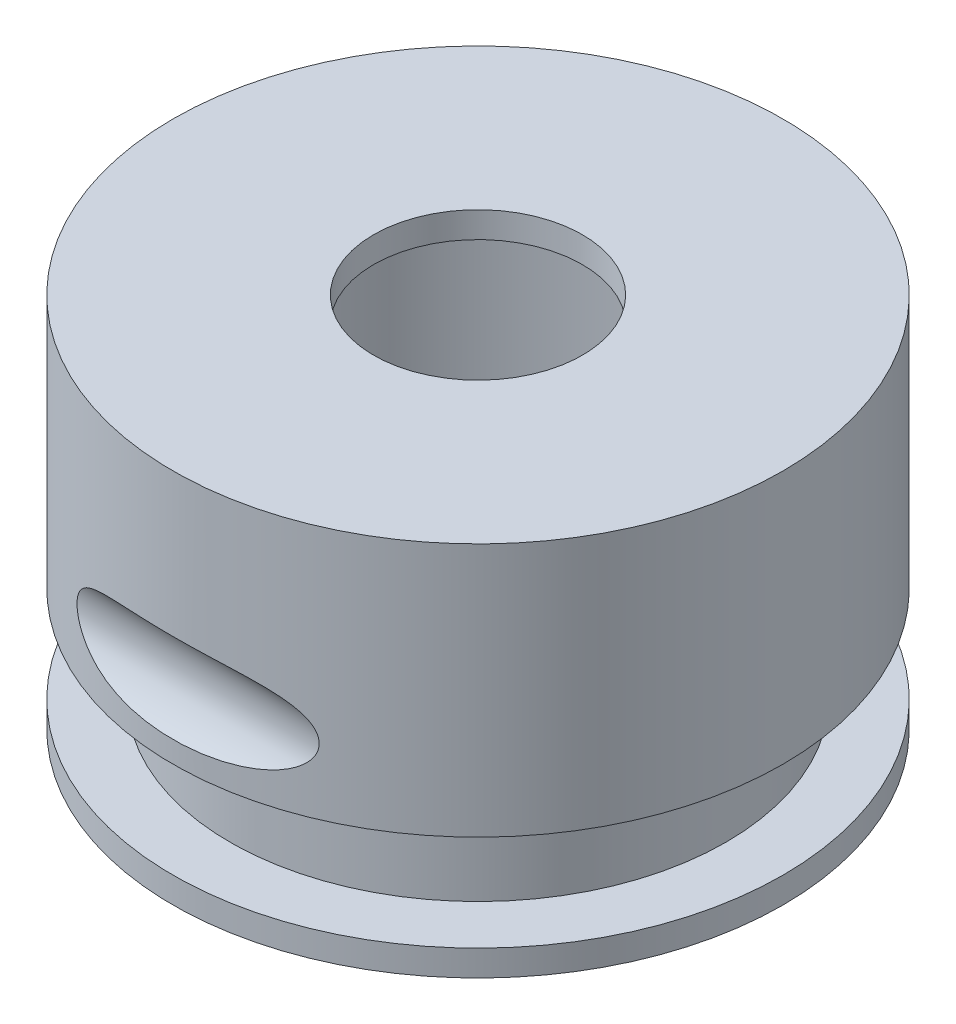
ISO-10303-21;
HEADER;
FILE_DESCRIPTION(('STEP AP214'),'2;1');
FILE_NAME('part.step','',(''),(''),'','','');
FILE_SCHEMA(('AUTOMOTIVE_DESIGN { 1 0 10303 214 1 1 1 1 }'));
ENDSEC;
DATA;
#1=APPLICATION_CONTEXT('core data for automotive mechanical design processes');
#2=APPLICATION_PROTOCOL_DEFINITION('international standard','automotive_design',2000,#1);
#3=PRODUCT_CONTEXT('',#1,'mechanical');
#4=PRODUCT('Part','Part','',(#3));
#5=PRODUCT_RELATED_PRODUCT_CATEGORY('part','',(#4));
#6=PRODUCT_DEFINITION_FORMATION('','',#4);
#7=PRODUCT_DEFINITION_CONTEXT('part definition',#1,'design');
#8=PRODUCT_DEFINITION('design','',#6,#7);
#9=PRODUCT_DEFINITION_SHAPE('','',#8);
#10=(LENGTH_UNIT() NAMED_UNIT(*) SI_UNIT(.MILLI.,.METRE.));
#11=(NAMED_UNIT(*) PLANE_ANGLE_UNIT() SI_UNIT($,.RADIAN.));
#12=(NAMED_UNIT(*) SI_UNIT($,.STERADIAN.) SOLID_ANGLE_UNIT());
#13=UNCERTAINTY_MEASURE_WITH_UNIT(LENGTH_MEASURE(1.E-05),#10,'distance_accuracy_value','');
#14=(GEOMETRIC_REPRESENTATION_CONTEXT(3) GLOBAL_UNCERTAINTY_ASSIGNED_CONTEXT((#13)) GLOBAL_UNIT_ASSIGNED_CONTEXT((#10,
#11,#12)) REPRESENTATION_CONTEXT('',''));
#15=CARTESIAN_POINT('',(0.,0.,0.));
#16=DIRECTION('',(0.,0.,1.));
#17=DIRECTION('',(1.,0.,0.));
#18=AXIS2_PLACEMENT_3D('',#15,#16,#17);
#19=CARTESIAN_POINT('',(0.,0.,0.));
#20=DIRECTION('',(0.,-1.,0.));
#21=DIRECTION('',(1.,0.,0.));
#22=AXIS2_PLACEMENT_3D('',#19,#20,#21);
#23=CYLINDRICAL_SURFACE('',#22,18.542);
#24=CARTESIAN_POINT('',(0.,0.,0.));
#25=DIRECTION('',(0.,-1.,0.));
#26=DIRECTION('',(1.,0.,0.));
#27=AXIS2_PLACEMENT_3D('',#24,#25,#26);
#28=CIRCLE('',#27,18.542);
#29=CARTESIAN_POINT('',(18.542,0.,0.));
#30=VERTEX_POINT('',#29);
#31=EDGE_CURVE('E90',#30,#30,#28,.F.);
#32=ORIENTED_EDGE('',*,*,#31,.T.);
#33=EDGE_LOOP('',(#32));
#34=FACE_BOUND('',#33,.T.);
#35=CARTESIAN_POINT('',(0.,1.57479999999999,0.));
#36=DIRECTION('',(0.,-1.,0.));
#37=DIRECTION('',(1.,0.,0.));
#38=AXIS2_PLACEMENT_3D('',#35,#36,#37);
#39=CIRCLE('',#38,18.542);
#40=CARTESIAN_POINT('',(18.542,1.57479999999999,0.));
#41=VERTEX_POINT('',#40);
#42=EDGE_CURVE('E17',#41,#41,#39,.T.);
#43=ORIENTED_EDGE('',*,*,#42,.T.);
#44=EDGE_LOOP('',(#43));
#45=FACE_BOUND('',#44,.T.);
#46=ADVANCED_FACE('F14',(#34,#45),#23,.T.);
#47=CARTESIAN_POINT('',(-18.542,1.57480000000182,0.));
#48=DIRECTION('',(0.,-1.,0.));
#49=DIRECTION('',(1.,0.,0.));
#50=AXIS2_PLACEMENT_3D('',#47,#48,#49);
#51=PLANE('',#50);
#52=CARTESIAN_POINT('',(0.,1.57479999999999,0.));
#53=DIRECTION('',(0.,-1.,0.));
#54=DIRECTION('',(1.,0.,0.));
#55=AXIS2_PLACEMENT_3D('',#52,#53,#54);
#56=CIRCLE('',#55,15.0749);
#57=CARTESIAN_POINT('',(15.0749,1.57479999999999,0.));
#58=VERTEX_POINT('',#57);
#59=EDGE_CURVE('E88',#58,#58,#56,.F.);
#60=ORIENTED_EDGE('',*,*,#59,.F.);
#61=EDGE_LOOP('',(#60));
#62=FACE_BOUND('',#61,.T.);
#63=ORIENTED_EDGE('',*,*,#42,.F.);
#64=EDGE_LOOP('',(#63));
#65=FACE_BOUND('',#64,.T.);
#66=ADVANCED_FACE('F98',(#62,#65),#51,.F.);
#67=CARTESIAN_POINT('',(0.,0.,0.));
#68=DIRECTION('',(0.,1.,0.));
#69=DIRECTION('',(-1.,0.,0.));
#70=AXIS2_PLACEMENT_3D('',#67,#68,#69);
#71=PLANE('',#70);
#72=ORIENTED_EDGE('',*,*,#31,.F.);
#73=EDGE_LOOP('',(#72));
#74=FACE_BOUND('',#73,.T.);
#75=CARTESIAN_POINT('',(0.,0.,0.));
#76=DIRECTION('',(0.,-1.,0.));
#77=DIRECTION('',(1.,0.,0.));
#78=AXIS2_PLACEMENT_3D('',#75,#76,#77);
#79=CIRCLE('',#78,14.2875);
#80=CARTESIAN_POINT('',(14.2875,0.,0.));
#81=VERTEX_POINT('',#80);
#82=EDGE_CURVE('E85',#81,#81,#79,.F.);
#83=ORIENTED_EDGE('',*,*,#82,.T.);
#84=EDGE_LOOP('',(#83));
#85=FACE_BOUND('',#84,.T.);
#86=ADVANCED_FACE('F100',(#74,#85),#71,.F.);
#87=CARTESIAN_POINT('',(0.,0.,0.));
#88=DIRECTION('',(0.,-1.,0.));
#89=DIRECTION('',(1.,0.,0.));
#90=AXIS2_PLACEMENT_3D('',#87,#88,#89);
#91=CYLINDRICAL_SURFACE('',#90,15.0749);
#92=ORIENTED_EDGE('',*,*,#59,.T.);
#93=EDGE_LOOP('',(#92));
#94=FACE_BOUND('',#93,.T.);
#95=CARTESIAN_POINT('',(0.,7.4168,0.));
#96=DIRECTION('',(0.,-1.,0.));
#97=DIRECTION('',(1.,0.,0.));
#98=AXIS2_PLACEMENT_3D('',#95,#96,#97);
#99=CIRCLE('',#98,15.0749);
#100=CARTESIAN_POINT('',(15.0749,7.4168,0.));
#101=VERTEX_POINT('',#100);
#102=EDGE_CURVE('E79',#101,#101,#99,.T.);
#103=ORIENTED_EDGE('',*,*,#102,.T.);
#104=EDGE_LOOP('',(#103));
#105=FACE_BOUND('',#104,.T.);
#106=ADVANCED_FACE('F71',(#94,#105),#91,.T.);
#107=CARTESIAN_POINT('',(0.,21.2852,0.));
#108=DIRECTION('',(0.,-1.,0.));
#109=DIRECTION('',(1.,0.,0.));
#110=AXIS2_PLACEMENT_3D('',#107,#108,#109);
#111=CYLINDRICAL_SURFACE('',#110,14.2875);
#112=CARTESIAN_POINT('',(-2.413,16.51,-14.0822614394848));
#113=CARTESIAN_POINT('',(-2.4129941654229,16.6444828539525,-14.0822640849239));
#114=CARTESIAN_POINT('',(-2.40171811928791,16.7790494973515,-14.0842089812061));
#115=CARTESIAN_POINT('',(-2.35692840265132,17.0444175766794,-14.0917720706717));
#116=CARTESIAN_POINT('',(-2.32339144732905,17.1752149203015,-14.0973941100415));
#117=CARTESIAN_POINT('',(-2.23512439102644,17.4291491082443,-14.1116568909036));
#118=CARTESIAN_POINT('',(-2.18041297379245,17.5522925952444,-14.1202949704718));
#119=CARTESIAN_POINT('',(-2.05139845079649,17.7876315555916,-14.1396129748515));
#120=CARTESIAN_POINT('',(-1.97709865871781,17.8998288762618,-14.1502925542272));
#121=CARTESIAN_POINT('',(-1.81022070536362,18.1112394069196,-14.1726104972307));
#122=CARTESIAN_POINT('',(-1.71748441936084,18.2103269927262,-14.1842566084736));
#123=CARTESIAN_POINT('',(-1.51668034327324,18.3916353589007,-14.2071294668387));
#124=CARTESIAN_POINT('',(-1.40860831500469,18.4738514612519,-14.2183560969461));
#125=CARTESIAN_POINT('',(-1.17936073480606,18.6195614877155,-14.239209533785));
#126=CARTESIAN_POINT('',(-1.05810387132596,18.6829290509236,-14.2488253620799));
#127=CARTESIAN_POINT('',(-0.806560128270515,18.7882847430487,-14.2652703332391));
#128=CARTESIAN_POINT('',(-0.676283587127068,18.8302969034328,-14.2721026067408));
#129=CARTESIAN_POINT('',(-0.454426863714997,18.88158745711,-14.2805506002235));
#130=CARTESIAN_POINT('',(-0.364274332939682,18.897093960641,-14.2831439024362));
#131=CARTESIAN_POINT('',(-0.182760749327515,18.9178021402957,-14.2866194430846));
#132=CARTESIAN_POINT('',(-0.0913997128679932,18.9230039559219,-14.2875017046841));
#133=CARTESIAN_POINT('',(0.134498264747015,18.9229941787058,-14.2874974914905));
#134=CARTESIAN_POINT('',(0.269080280463436,18.911715635197,-14.2855808178532));
#135=CARTESIAN_POINT('',(0.534480313001756,18.8669150955965,-14.2781184431882));
#136=CARTESIAN_POINT('',(0.665294249469493,18.8333698673672,-14.2725689519125));
#137=CARTESIAN_POINT('',(0.919263544158507,18.7450786210434,-14.2584633042745));
#138=CARTESIAN_POINT('',(1.04242540527749,18.6903508983901,-14.2499097431335));
#139=CARTESIAN_POINT('',(1.27779527143734,18.5612979540388,-14.2307363346093));
#140=CARTESIAN_POINT('',(1.39000514595465,18.4869760850566,-14.2201168408054));
#141=CARTESIAN_POINT('',(1.60140200107601,18.3200756223334,-14.1978723461087));
#142=CARTESIAN_POINT('',(1.70046721739635,18.2273438522937,-14.1862394026316));
#143=CARTESIAN_POINT('',(1.88173226159046,18.0265582632878,-14.1633368183182));
#144=CARTESIAN_POINT('',(1.96392734302548,17.9185001466513,-14.1520672804763));
#145=CARTESIAN_POINT('',(2.1096150168268,17.6892652113623,-14.1310880972426));
#146=CARTESIAN_POINT('',(2.17297748654591,17.5680046849356,-14.1213895063312));
#147=CARTESIAN_POINT('',(2.27832271517408,17.3164530339822,-14.1047783428417));
#148=CARTESIAN_POINT('',(2.3203295808649,17.1861722814071,-14.0978626307225));
#149=CARTESIAN_POINT('',(2.37160527301209,16.9643296254771,-14.089306452022));
#150=CARTESIAN_POINT('',(2.38710506140066,16.8741966035536,-14.0866779981716));
#151=CARTESIAN_POINT('',(2.40780433382248,16.6927219384709,-14.0831546054678));
#152=CARTESIAN_POINT('',(2.41300396456101,16.6013803125445,-14.0822596419244));
#153=CARTESIAN_POINT('',(2.4129941654229,16.3755171460475,-14.0822640849239));
#154=CARTESIAN_POINT('',(2.40171811928791,16.2409505026485,-14.0842089812061));
#155=CARTESIAN_POINT('',(2.35692840265132,15.9755824233206,-14.0917720706717));
#156=CARTESIAN_POINT('',(2.32339144732905,15.8447850796986,-14.0973941100415));
#157=CARTESIAN_POINT('',(2.23512439102644,15.5908508917558,-14.1116568909036));
#158=CARTESIAN_POINT('',(2.18041297379245,15.4677074047557,-14.1202949704718));
#159=CARTESIAN_POINT('',(2.05139845079648,15.2323684444084,-14.1396129748515));
#160=CARTESIAN_POINT('',(1.97709865871781,15.1201711237383,-14.1502925542272));
#161=CARTESIAN_POINT('',(1.81022070536362,14.9087605930805,-14.1726104972307));
#162=CARTESIAN_POINT('',(1.71748441936083,14.8096730072739,-14.1842566084736));
#163=CARTESIAN_POINT('',(1.51668034327324,14.6283646410994,-14.2071294668387));
#164=CARTESIAN_POINT('',(1.40860831500468,14.5461485387482,-14.2183560969461));
#165=CARTESIAN_POINT('',(1.17936073480606,14.4004385122846,-14.239209533785));
#166=CARTESIAN_POINT('',(1.05810387132596,14.3370709490764,-14.2488253620799));
#167=CARTESIAN_POINT('',(0.806560128270514,14.2317152569513,-14.2652703332391));
#168=CARTESIAN_POINT('',(0.676283587127068,14.1897030965673,-14.2721026067408));
#169=CARTESIAN_POINT('',(0.454426863715122,14.1384125428901,-14.2805506002235));
#170=CARTESIAN_POINT('',(0.364274332939936,14.1229060393591,-14.2831439024362));
#171=CARTESIAN_POINT('',(0.182760749328028,14.1021978597044,-14.2866194430846));
#172=CARTESIAN_POINT('',(0.0913997128686367,14.0969960440782,-14.287501704684));
#173=CARTESIAN_POINT('',(-0.134498264746241,14.0970058212942,-14.2874974914905));
#174=CARTESIAN_POINT('',(-0.269080280462665,14.108284364803,-14.2855808178532));
#175=CARTESIAN_POINT('',(-0.534480313000997,14.1530849044034,-14.2781184431882));
#176=CARTESIAN_POINT('',(-0.665294249468743,14.1866301326327,-14.2725689519125));
#177=CARTESIAN_POINT('',(-0.919263544157785,14.2749213789564,-14.2584633042746));
#178=CARTESIAN_POINT('',(-1.04242540527678,14.3296491016097,-14.2499097431335));
#179=CARTESIAN_POINT('',(-1.27779527143667,14.4587020459609,-14.2307363346094));
#180=CARTESIAN_POINT('',(-1.39000514595401,14.533023914943,-14.2201168408054));
#181=CARTESIAN_POINT('',(-1.60140200107542,14.6999243776662,-14.1978723461088));
#182=CARTESIAN_POINT('',(-1.70046721739579,14.7926561477058,-14.1862394026317));
#183=CARTESIAN_POINT('',(-1.88173226158996,14.9934417367116,-14.1633368183183));
#184=CARTESIAN_POINT('',(-1.96392734302502,15.1014998533481,-14.1520672804764));
#185=CARTESIAN_POINT('',(-2.10961501682641,15.3307347886371,-14.1310880972427));
#186=CARTESIAN_POINT('',(-2.17297748654556,15.4519953150637,-14.1213895063312));
#187=CARTESIAN_POINT('',(-2.27832271517381,15.7035469660171,-14.1047783428417));
#188=CARTESIAN_POINT('',(-2.32032958086468,15.8338277185922,-14.0978626307225));
#189=CARTESIAN_POINT('',(-2.37160527301197,16.0556703745224,-14.0893064520221));
#190=CARTESIAN_POINT('',(-2.38710506140059,16.1458033964459,-14.0866779981716));
#191=CARTESIAN_POINT('',(-2.40780433382246,16.3272780615289,-14.0831546054678));
#192=CARTESIAN_POINT('',(-2.41300396456101,16.4186196874554,-14.0822596419244));
#193=CARTESIAN_POINT('',(-2.413,16.51,-14.0822614394848));
#194=B_SPLINE_CURVE_WITH_KNOTS('',3,(#112,#113,#114,#115,#116,#117,#118,#119,#120,#121,#122,
#123,#124,#125,#126,#127,#128,#129,#130,#131,#132,#133,#134,#135,#136,#137,#138,#139,#140,#141,
#142,#143,#144,#145,#146,#147,#148,#149,#150,#151,#152,#153,#154,#155,#156,#157,#158,#159,#160,
#161,#162,#163,#164,#165,#166,#167,#168,#169,#170,#171,#172,#173,#174,#175,#176,#177,#178,#179,
#180,#181,#182,#183,#184,#185,#186,#187,#188,#189,#190,#191,#192,#193),.UNSPECIFIED.,.T.,.F.,(4,
2,2,2,2,2,2,2,2,2,2,2,2,2,2,2,2,2,2,2,2,2,2,2,2,2,2,2,2,2,2,2,2,2,2,2,2,2,2,2,4),(0.,
0.403113083801031,0.806648488112731,1.20982863302685,1.61294061735989,2.01967198910566,
2.42651598478672,2.8360289872107,3.2450801343052,3.51905505675224,3.79302627016403,
4.19618566353341,4.59976635930512,5.00299925518491,5.40616319940577,5.81283391453748,
6.21961889073664,6.62915245437704,7.03822269324399,7.31213957693063,7.58605255918719,
7.98916564298822,8.39270104729992,8.79588119221403,9.19899317654708,9.60572454829285,
10.0125685439739,10.4220815463979,10.8311326934924,11.105107615939,11.3790788293504,
11.7822382227198,12.1858189184915,12.5890518143713,12.9922157585922,13.3988864737239,
13.805671449923,14.2152050135634,14.6242752524304,14.8981921361174,15.1721051183744),.UNSPECIFIED.);
#195=CARTESIAN_POINT('',(-2.413,16.51,-14.0822614394848));
#196=VERTEX_POINT('',#195);
#197=EDGE_CURVE('E74',#196,#196,#194,.T.);
#198=ORIENTED_EDGE('',*,*,#197,.T.);
#199=EDGE_LOOP('',(#198));
#200=FACE_BOUND('',#199,.T.);
#201=CARTESIAN_POINT('',(0.,21.2852,0.));
#202=DIRECTION('',(0.,-1.,0.));
#203=DIRECTION('',(1.,0.,0.));
#204=AXIS2_PLACEMENT_3D('',#201,#202,#203);
#205=CIRCLE('',#204,14.2875);
#206=CARTESIAN_POINT('',(14.2875,21.2852,0.));
#207=VERTEX_POINT('',#206);
#208=EDGE_CURVE('E82',#207,#207,#205,.T.);
#209=ORIENTED_EDGE('',*,*,#208,.F.);
#210=EDGE_LOOP('',(#209));
#211=FACE_BOUND('',#210,.T.);
#212=ORIENTED_EDGE('',*,*,#82,.F.);
#213=EDGE_LOOP('',(#212));
#214=FACE_BOUND('',#213,.T.);
#215=ADVANCED_FACE('F66',(#200,#211,#214),#111,.F.);
#216=CARTESIAN_POINT('',(0.,21.2852,0.));
#217=DIRECTION('',(0.,-1.,0.));
#218=DIRECTION('',(1.,0.,0.));
#219=AXIS2_PLACEMENT_3D('',#216,#217,#218);
#220=PLANE('',#219);
#221=ORIENTED_EDGE('',*,*,#208,.T.);
#222=EDGE_LOOP('',(#221));
#223=FACE_BOUND('',#222,.T.);
#224=CARTESIAN_POINT('',(0.,21.2852,0.));
#225=DIRECTION('',(0.,1.,0.));
#226=DIRECTION('',(-1.,0.,0.));
#227=AXIS2_PLACEMENT_3D('',#224,#225,#226);
#228=CIRCLE('',#227,6.35);
#229=CARTESIAN_POINT('',(-6.35,21.2852,0.));
#230=VERTEX_POINT('',#229);
#231=EDGE_CURVE('E55',#230,#230,#228,.T.);
#232=ORIENTED_EDGE('',*,*,#231,.T.);
#233=EDGE_LOOP('',(#232));
#234=FACE_BOUND('',#233,.T.);
#235=ADVANCED_FACE('F62',(#223,#234),#220,.T.);
#236=CARTESIAN_POINT('',(-18.5419999999994,11.4300000000019,20.193));
#237=DIRECTION('',(1.,0.,0.));
#238=DIRECTION('',(0.,1.,0.));
#239=AXIS2_PLACEMENT_3D('',#236,#237,#238);
#240=CYLINDRICAL_SURFACE('',#239,3.175);
#241=CARTESIAN_POINT('',(0.,14.1419778760178,18.542));
#242=CARTESIAN_POINT('',(0.209689416286932,14.1419776634456,18.5420000356464));
#243=CARTESIAN_POINT('',(0.419377848483888,14.1398214428807,18.5384421615188));
#244=CARTESIAN_POINT('',(0.838420806961999,14.1310871751409,18.5242209719151));
#245=CARTESIAN_POINT('',(1.04777533736145,14.1245091829328,18.5135577447653));
#246=CARTESIAN_POINT('',(1.46606376682757,14.1065881506321,18.4851404623851));
#247=CARTESIAN_POINT('',(1.67499681669532,14.0952391831695,18.4673775880428));
#248=CARTESIAN_POINT('',(2.09178491636182,14.0671999408883,18.4248222836886));
#249=CARTESIAN_POINT('',(2.29964000202272,14.0505098449341,18.4000300890785));
#250=CARTESIAN_POINT('',(2.71256539435544,14.0110558846209,18.3436884856784));
#251=CARTESIAN_POINT('',(2.91764494530773,13.9883294807597,18.3121809816552));
#252=CARTESIAN_POINT('',(3.32577788574017,13.9355907055532,18.2424729949647));
#253=CARTESIAN_POINT('',(3.52883088747169,13.9055769666956,18.204271256459));
#254=CARTESIAN_POINT('',(3.93169225419007,13.8367652316009,18.1215274359547));
#255=CARTESIAN_POINT('',(4.13150660724591,13.7979860753498,18.0769990273517));
#256=CARTESIAN_POINT('',(4.52721775088981,13.7095228386223,17.9819741771628));
#257=CARTESIAN_POINT('',(4.72311673896977,13.6598450738374,17.9314811998057));
#258=CARTESIAN_POINT('',(4.99823096505494,13.5792642890026,17.8558308454542));
#259=CARTESIAN_POINT('',(5.07970592249081,13.5540132159264,17.8328191257023));
#260=CARTESIAN_POINT('',(5.24148712528007,13.5007356747083,17.7859403989104));
#261=CARTESIAN_POINT('',(5.32179338641675,13.4727092440876,17.7620734034361));
#262=CARTESIAN_POINT('',(5.56121824815225,13.3838041282604,17.6891613943912));
#263=CARTESIAN_POINT('',(5.7183248284638,13.3182467730076,17.6389482894549));
#264=CARTESIAN_POINT('',(5.96617882636381,13.1994640599236,17.5562098011486));
#265=CARTESIAN_POINT('',(6.05941821430119,13.1510460881857,17.5242286425966));
#266=CARTESIAN_POINT('',(6.24195655575993,13.0471909475673,17.4600426053391));
#267=CARTESIAN_POINT('',(6.33125315823655,12.9917496649895,17.4278376060591));
#268=CARTESIAN_POINT('',(6.50404547452521,12.8730538729412,17.3640891191981));
#269=CARTESIAN_POINT('',(6.58756945577175,12.8098423846904,17.3325430281958));
#270=CARTESIAN_POINT('',(6.74728696966417,12.6742008383872,17.2709923433093));
#271=CARTESIAN_POINT('',(6.82349265639715,12.6017865458526,17.2409852335425));
#272=CARTESIAN_POINT('',(6.95336070195983,12.4600752480956,17.1889659972502));
#273=CARTESIAN_POINT('',(7.00863465859888,12.3924487096999,17.1664735252406));
#274=CARTESIAN_POINT('',(7.11007916788057,12.2495895339851,17.1247057473368));
#275=CARTESIAN_POINT('',(7.15624549822551,12.1743533931876,17.1054319342463));
#276=CARTESIAN_POINT('',(7.23707115715186,12.0155599617991,17.0713948971341));
#277=CARTESIAN_POINT('',(7.27157131359909,11.9319063220052,17.0566942696952));
#278=CARTESIAN_POINT('',(7.32481139203501,11.7589826844392,17.0339007328419));
#279=CARTESIAN_POINT('',(7.343613874358,11.6697365195426,17.0257815978392));
#280=CARTESIAN_POINT('',(7.35618306166899,11.5546948287133,17.0203506653073));
#281=CARTESIAN_POINT('',(7.35821745598825,11.5298133586953,17.0194712527155));
#282=CARTESIAN_POINT('',(7.3609369541734,11.4799586176424,17.0182952642664));
#283=CARTESIAN_POINT('',(7.36162185053015,11.4549853330808,17.0179987780444));
#284=CARTESIAN_POINT('',(7.36161185658816,11.3536232765271,17.01800373535));
#285=CARTESIAN_POINT('',(7.35518135596733,11.2771339667984,17.0207893771684));
#286=CARTESIAN_POINT('',(7.33004282179063,11.1265183934957,17.031629726184));
#287=CARTESIAN_POINT('',(7.3113063781572,11.0523980151893,17.0396966258021));
#288=CARTESIAN_POINT('',(7.2633188282434,10.9090033460349,17.0602059593835));
#289=CARTESIAN_POINT('',(7.23415066206763,10.8396958383508,17.0726138626041));
#290=CARTESIAN_POINT('',(7.16717259850072,10.7062380790036,17.1008399336));
#291=CARTESIAN_POINT('',(7.12936240268834,10.6420880055374,17.1166582191395));
#292=CARTESIAN_POINT('',(7.01811745222925,10.4763242200239,17.1626763943894));
#293=CARTESIAN_POINT('',(6.9382066624289,10.3797196514009,17.1952219953315));
#294=CARTESIAN_POINT('',(6.76513482807936,10.200717653182,17.2640508978979));
#295=CARTESIAN_POINT('',(6.67193155012426,10.118367433646,17.3003460072016));
#296=CARTESIAN_POINT('',(6.48696239801546,9.97406040070867,17.3704872995751));
#297=CARTESIAN_POINT('',(6.39608717628443,9.91086785370162,17.404186463198));
#298=CARTESIAN_POINT('',(6.209067219563,9.79286115887927,17.4717814614594));
#299=CARTESIAN_POINT('',(6.11291814345099,9.73805405844477,17.5056774369439));
#300=CARTESIAN_POINT('',(5.91652105577033,9.63552434639299,17.573029047651));
#301=CARTESIAN_POINT('',(5.81626473445576,9.58781710360901,17.6064835887512));
#302=CARTESIAN_POINT('',(5.61277506075185,9.49859956302676,17.6724067758523));
#303=CARTESIAN_POINT('',(5.50954246959037,9.45708769714897,17.7048756696623));
#304=CARTESIAN_POINT('',(5.29481388256823,9.37719054998461,17.770312527805));
#305=CARTESIAN_POINT('',(5.18318057388106,9.33911449510883,17.8032050172246));
#306=CARTESIAN_POINT('',(4.95780634946536,9.26807345140026,17.8672791430537));
#307=CARTESIAN_POINT('',(4.84406497163786,9.23510959838294,17.8984603982743));
#308=CARTESIAN_POINT('',(4.50013457004837,9.14279088113997,17.9891835981109));
#309=CARTESIAN_POINT('',(4.26739476605625,9.09006420914779,18.04585736963));
#310=CARTESIAN_POINT('',(3.79735357546868,8.99812702300183,18.1505912169153));
#311=CARTESIAN_POINT('',(3.56005020609983,8.95892253073223,18.1986474504383));
#312=CARTESIAN_POINT('',(3.0823903191895,8.89119674290003,18.2856099749894));
#313=CARTESIAN_POINT('',(2.84203514279481,8.86267091178322,18.3245201480102));
#314=CARTESIAN_POINT('',(2.3862456978883,8.81697687305575,18.3890860294092));
#315=CARTESIAN_POINT('',(2.17104098117797,8.79889346689032,18.4157390368195));
#316=CARTESIAN_POINT('',(1.73941972138531,8.76855015333383,18.4615080553054));
#317=CARTESIAN_POINT('',(1.52300314158693,8.75629042336028,18.4806238367576));
#318=CARTESIAN_POINT('',(1.08902006252735,8.73690792358868,18.5112724507458));
#319=CARTESIAN_POINT('',(0.871452199679973,8.72979436963531,18.5227916760172));
#320=CARTESIAN_POINT('',(0.435922560162136,8.72035113493047,18.5381557921424));
#321=CARTESIAN_POINT('',(0.217960748452466,8.71802190302787,18.5419999629475));
#322=CARTESIAN_POINT('',(-0.209689416286836,8.71802233655734,18.5420000356464));
#323=CARTESIAN_POINT('',(-0.419377848483779,8.72017855712281,18.5384421615188));
#324=CARTESIAN_POINT('',(-0.838420806961878,8.72891282486305,18.5242209719151));
#325=CARTESIAN_POINT('',(-1.04777533736133,8.73549081707095,18.5135577447653));
#326=CARTESIAN_POINT('',(-1.46606376682746,8.75341184937156,18.4851404623851));
#327=CARTESIAN_POINT('',(-1.67499681669521,8.76476081683423,18.4673775880428));
#328=CARTESIAN_POINT('',(-2.09178491636172,8.79280005911539,18.4248222836886));
#329=CARTESIAN_POINT('',(-2.29964000202262,8.80949015506956,18.4000300890785));
#330=CARTESIAN_POINT('',(-2.71256539435535,8.84894411538281,18.3436884856784));
#331=CARTESIAN_POINT('',(-2.91764494530764,8.87167051924398,18.3121809816552));
#332=CARTESIAN_POINT('',(-3.32577788574011,8.92440929445054,18.2424729949647));
#333=CARTESIAN_POINT('',(-3.52883088747164,8.95442303330807,18.204271256459));
#334=CARTESIAN_POINT('',(-3.93169225419004,9.0232347684028,18.1215274359547));
#335=CARTESIAN_POINT('',(-4.13150660724588,9.06201392465387,18.0769990273517));
#336=CARTESIAN_POINT('',(-4.5272177508898,9.15047716138139,17.9819741771628));
#337=CARTESIAN_POINT('',(-4.72311673896977,9.20015492616629,17.9314811998057));
#338=CARTESIAN_POINT('',(-4.99823096505493,9.28073571100114,17.8558308454542));
#339=CARTESIAN_POINT('',(-5.0797059224908,9.30598678407733,17.8328191257023));
#340=CARTESIAN_POINT('',(-5.24148712528007,9.35926432529545,17.7859403989105));
#341=CARTESIAN_POINT('',(-5.32179338641675,9.38729075591612,17.7620734034361));
#342=CARTESIAN_POINT('',(-5.56121824815224,9.47619587174327,17.6891613943912));
#343=CARTESIAN_POINT('',(-5.7183248284638,9.54175322699613,17.6389482894549));
#344=CARTESIAN_POINT('',(-5.9661788263638,9.66053594008007,17.5562098011486));
#345=CARTESIAN_POINT('',(-6.05941821430119,9.70895391181804,17.5242286425966));
#346=CARTESIAN_POINT('',(-6.24195655575992,9.81280905243635,17.4600426053391));
#347=CARTESIAN_POINT('',(-6.33125315823654,9.86825033501421,17.4278376060591));
#348=CARTESIAN_POINT('',(-6.5040454745252,9.98694612706252,17.3640891191982));
#349=CARTESIAN_POINT('',(-6.58756945577175,10.0501576153133,17.3325430281958));
#350=CARTESIAN_POINT('',(-6.74728696966417,10.1857991616165,17.2709923433093));
#351=CARTESIAN_POINT('',(-6.82349265639715,10.2582134541512,17.2409852335425));
#352=CARTESIAN_POINT('',(-6.95336070195983,10.3999247519081,17.1889659972502));
#353=CARTESIAN_POINT('',(-7.00863465859888,10.4675512903038,17.1664735252406));
#354=CARTESIAN_POINT('',(-7.11007916788058,10.6104104660186,17.1247057473368));
#355=CARTESIAN_POINT('',(-7.15624549822551,10.6856466068162,17.1054319342463));
#356=CARTESIAN_POINT('',(-7.23707115715186,10.8444400382046,17.0713948971341));
#357=CARTESIAN_POINT('',(-7.27157131359909,10.9280936779985,17.0566942696952));
#358=CARTESIAN_POINT('',(-7.32481139203501,11.1010173155645,17.0339007328419));
#359=CARTESIAN_POINT('',(-7.34361387435801,11.1902634804611,17.0257815978392));
#360=CARTESIAN_POINT('',(-7.35618306166899,11.3053051712905,17.0203506653073));
#361=CARTESIAN_POINT('',(-7.35821745598824,11.3301866413085,17.0194712527155));
#362=CARTESIAN_POINT('',(-7.3609369541734,11.3800413823613,17.0182952642664));
#363=CARTESIAN_POINT('',(-7.36162185053015,11.4050146669229,17.0179987780444));
#364=CARTESIAN_POINT('',(-7.36161185658817,11.5063767234766,17.01800373535));
#365=CARTESIAN_POINT('',(-7.35518135596733,11.5828660332053,17.0207893771684));
#366=CARTESIAN_POINT('',(-7.33004282179062,11.733481606508,17.031629726184));
#367=CARTESIAN_POINT('',(-7.3113063781572,11.8076019848144,17.0396966258021));
#368=CARTESIAN_POINT('',(-7.2633188282434,11.9509966539688,17.0602059593835));
#369=CARTESIAN_POINT('',(-7.23415066206763,12.020304161653,17.0726138626041));
#370=CARTESIAN_POINT('',(-7.16717259850072,12.1537619210001,17.1008399336));
#371=CARTESIAN_POINT('',(-7.12936240268834,12.2179119944663,17.1166582191395));
#372=CARTESIAN_POINT('',(-7.01811745222925,12.3836757799798,17.1626763943894));
#373=CARTESIAN_POINT('',(-6.9382066624289,12.4802803486028,17.1952219953315));
#374=CARTESIAN_POINT('',(-6.76513482807936,12.6592823468217,17.2640508978979));
#375=CARTESIAN_POINT('',(-6.67193155012426,12.7416325663578,17.3003460072016));
#376=CARTESIAN_POINT('',(-6.48696239801546,12.885939599295,17.3704872995751));
#377=CARTESIAN_POINT('',(-6.39608717628443,12.9491321463021,17.404186463198));
#378=CARTESIAN_POINT('',(-6.209067219563,13.0671388411244,17.4717814614594));
#379=CARTESIAN_POINT('',(-6.11291814345099,13.1219459415589,17.5056774369439));
#380=CARTESIAN_POINT('',(-5.91652105577033,13.2244756536107,17.573029047651));
#381=CARTESIAN_POINT('',(-5.81626473445576,13.2721828963947,17.6064835887512));
#382=CARTESIAN_POINT('',(-5.61277506075186,13.361400436977,17.6724067758523));
#383=CARTESIAN_POINT('',(-5.50954246959037,13.4029123028547,17.7048756696623));
#384=CARTESIAN_POINT('',(-5.29481388256823,13.4828094500191,17.770312527805));
#385=CARTESIAN_POINT('',(-5.18318057388106,13.5208855048949,17.8032050172246));
#386=CARTESIAN_POINT('',(-4.95780634946536,13.5919265486035,17.8672791430537));
#387=CARTESIAN_POINT('',(-4.84406497163785,13.6248904016208,17.8984603982743));
#388=CARTESIAN_POINT('',(-4.50013457004836,13.7172091188637,17.9891835981109));
#389=CARTESIAN_POINT('',(-4.26739476605623,13.7699357908559,18.04585736963));
#390=CARTESIAN_POINT('',(-3.79735357546867,13.8618729770019,18.1505912169153));
#391=CARTESIAN_POINT('',(-3.56005020609983,13.9010774692715,18.1986474504383));
#392=CARTESIAN_POINT('',(-3.0823903191895,13.9688032571037,18.2856099749894));
#393=CARTESIAN_POINT('',(-2.84203514279481,13.9973290882205,18.3245201480102));
#394=CARTESIAN_POINT('',(-2.3862456978883,14.043023126948,18.3890860294092));
#395=CARTESIAN_POINT('',(-2.17104098117796,14.0611065331134,18.4157390368195));
#396=CARTESIAN_POINT('',(-1.7394197213853,14.0914498466699,18.4615080553054));
#397=CARTESIAN_POINT('',(-1.52300314158692,14.1037095766434,18.4806238367576));
#398=CARTESIAN_POINT('',(-1.08902006252733,14.1230920764151,18.5112724507458));
#399=CARTESIAN_POINT('',(-0.871452199679942,14.1302056303686,18.5227916760172));
#400=CARTESIAN_POINT('',(-0.435922560162082,14.139648865073,18.5381557921424));
#401=CARTESIAN_POINT('',(-0.217960748452397,14.1419780969751,18.5419999629475));
#402=CARTESIAN_POINT('',(0.,14.1419778760178,18.542));
#403=B_SPLINE_CURVE_WITH_KNOTS('',3,(#241,#242,#243,#244,#245,#246,#247,#248,#249,#250,#251,
#252,#253,#254,#255,#256,#257,#258,#259,#260,#261,#262,#263,#264,#265,#266,#267,#268,#269,#270,
#271,#272,#273,#274,#275,#276,#277,#278,#279,#280,#281,#282,#283,#284,#285,#286,#287,#288,#289,
#290,#291,#292,#293,#294,#295,#296,#297,#298,#299,#300,#301,#302,#303,#304,#305,#306,#307,#308,
#309,#310,#311,#312,#313,#314,#315,#316,#317,#318,#319,#320,#321,#322,#323,#324,#325,#326,#327,
#328,#329,#330,#331,#332,#333,#334,#335,#336,#337,#338,#339,#340,#341,#342,#343,#344,#345,#346,
#347,#348,#349,#350,#351,#352,#353,#354,#355,#356,#357,#358,#359,#360,#361,#362,#363,#364,#365,
#366,#367,#368,#369,#370,#371,#372,#373,#374,#375,#376,#377,#378,#379,#380,#381,#382,#383,#384,
#385,#386,#387,#388,#389,#390,#391,#392,#393,#394,#395,#396,#397,#398,#399,#400,#401,#402),
.UNSPECIFIED.,.T.,.F.,(4,2,2,2,2,2,2,2,2,2,2,2,2,2,2,2,2,2,2,2,2,2,2,2,2,2,2,2,2,2,2,2,2,2,2,2,
2,2,2,2,2,2,2,2,2,2,2,2,2,2,2,2,2,2,2,2,2,2,2,2,2,2,2,2,2,2,2,2,2,2,2,2,2,2,2,2,2,2,2,2,4),(0.,
0.629024940750439,1.2580420622612,1.88784298317768,2.51762281545569,3.1435821138772,
3.76965896822716,4.39440274614054,5.01878543984691,5.28377859915764,5.54876817640062,
6.08041538960043,6.40965337954466,6.73908511037861,7.06676874454084,7.39389839893818,
7.66380532453793,7.93383708651106,8.20741704611295,8.47990142436549,8.55481086084225,
8.62973181506944,8.85875485772364,9.08830850106323,9.3160761757987,9.54385171685567,
9.93019644022695,10.3177972129305,10.6644015737693,11.0112956498557,11.3589300426957,
11.706476297842,12.0736615005303,12.4409281669418,13.1759750655353,13.9113488840144,
14.6464100113995,15.2990001986851,15.9516102657665,16.6053861624599,17.2592233913908,
17.8882483321412,18.5172654536519,19.1470663745684,19.7768462068464,20.402805505268,
21.028882359618,21.6536261375314,22.2780088312378,22.5430019905485,22.8079915677915,
23.3396387809913,23.6688767709355,23.9983085017695,24.3259921359317,24.653121790329,
24.9230287159288,25.1930604779019,25.4666404375038,25.7391248157564,25.8140342522331,
25.8889552064603,26.1179782491145,26.3475318924541,26.5752995671896,26.8030751082465,
27.1894198316178,27.5770206043213,27.9236249651601,28.2705190412465,28.6181534340866,
28.9656996892329,29.3328848919211,29.7001515583327,30.4351984569262,31.1705722754052,
31.9056334027903,32.558223590076,33.2108336571573,33.8646095538508,34.5184467827817),.UNSPECIFIED.);
#404=CARTESIAN_POINT('',(0.,14.1419778760178,18.542));
#405=VERTEX_POINT('',#404);
#406=EDGE_CURVE('E49',#405,#405,#403,.T.);
#407=ORIENTED_EDGE('',*,*,#406,.F.);
#408=EDGE_LOOP('',(#407));
#409=FACE_BOUND('',#408,.T.);
#410=ADVANCED_FACE('F57',(#409),#240,.F.);
#411=CARTESIAN_POINT('',(-15.0749,7.4168,0.));
#412=DIRECTION('',(0.,1.,0.));
#413=DIRECTION('',(-1.,0.,0.));
#414=AXIS2_PLACEMENT_3D('',#411,#412,#413);
#415=PLANE('',#414);
#416=CARTESIAN_POINT('',(0.,7.4168,0.));
#417=DIRECTION('',(0.,-1.,0.));
#418=DIRECTION('',(1.,0.,0.));
#419=AXIS2_PLACEMENT_3D('',#416,#417,#418);
#420=CIRCLE('',#419,18.542);
#421=CARTESIAN_POINT('',(18.542,7.4168,0.));
#422=VERTEX_POINT('',#421);
#423=EDGE_CURVE('E35',#422,#422,#420,.F.);
#424=ORIENTED_EDGE('',*,*,#423,.F.);
#425=EDGE_LOOP('',(#424));
#426=FACE_BOUND('',#425,.T.);
#427=ORIENTED_EDGE('',*,*,#102,.F.);
#428=EDGE_LOOP('',(#427));
#429=FACE_BOUND('',#428,.T.);
#430=ADVANCED_FACE('F61',(#426,#429),#415,.F.);
#431=CARTESIAN_POINT('',(0.,16.51,-21.2852000000001));
#432=DIRECTION('',(0.,0.,1.));
#433=DIRECTION('',(1.,0.,0.));
#434=AXIS2_PLACEMENT_3D('',#431,#432,#433);
#435=CYLINDRICAL_SURFACE('',#434,2.413);
#436=CARTESIAN_POINT('',(0.,14.097,-18.542));
#437=CARTESIAN_POINT('',(0.134923198830412,14.0970058108234,-18.5419980202353));
#438=CARTESIAN_POINT('',(0.269932627462605,14.1083548560213,-18.5405117433823));
#439=CARTESIAN_POINT('',(0.536195095437396,14.153448620568,-18.5347254669268));
#440=CARTESIAN_POINT('',(0.667443961995333,14.1872172840779,-18.5304224591235));
#441=CARTESIAN_POINT('',(0.922288938027258,14.2761364356109,-18.5194871940633));
#442=CARTESIAN_POINT('',(1.04589024164775,14.3312722222605,-18.5128565386091));
#443=CARTESIAN_POINT('',(1.28205794934299,14.4613251213505,-18.4980028571572));
#444=CARTESIAN_POINT('',(1.39462662655742,14.5362381471305,-18.4897801602237));
#445=CARTESIAN_POINT('',(1.60622220191837,14.7041874322828,-18.4726056232663));
#446=CARTESIAN_POINT('',(1.70517531989353,14.7973162828584,-18.4636502000882));
#447=CARTESIAN_POINT('',(1.88611722385334,14.9988825654849,-18.4460460040405));
#448=CARTESIAN_POINT('',(1.96810139738298,15.1073241463634,-18.4373973150747));
#449=CARTESIAN_POINT('',(2.11306198533279,15.336946480976,-18.4213487524902));
#450=CARTESIAN_POINT('',(2.17595924143427,15.4581775510948,-18.4139541342295));
#451=CARTESIAN_POINT('',(2.28040848803096,15.7095096438621,-18.401312299661));
#452=CARTESIAN_POINT('',(2.32198429660271,15.8396005842832,-18.3960626885158));
#453=CARTESIAN_POINT('',(2.37245790929402,16.0603312314056,-18.3896056759543));
#454=CARTESIAN_POINT('',(2.38763953630735,16.1495623987848,-18.3876329959534));
#455=CARTESIAN_POINT('',(2.40791249060823,16.3291828024848,-18.3849891131983));
#456=CARTESIAN_POINT('',(2.41300389786019,16.4195720296224,-18.38431790013));
#457=CARTESIAN_POINT('',(2.41299418442639,16.6449177477272,-18.384321312391));
#458=CARTESIAN_POINT('',(2.40164602540634,16.779921739384,-18.3858205493358));
#459=CARTESIAN_POINT('',(2.35655610141875,17.0461729085608,-18.3916531061044));
#460=CARTESIAN_POINT('',(2.32279037371098,17.1774159090875,-18.3959894585247));
#461=CARTESIAN_POINT('',(2.23387980851085,17.432248479376,-18.4069970081619));
#462=CARTESIAN_POINT('',(2.17874981113949,17.5558432927891,-18.4136665843548));
#463=CARTESIAN_POINT('',(2.04871054906556,17.7920001087467,-18.4285868065152));
#464=CARTESIAN_POINT('',(1.97380535706027,17.9045643764921,-18.436837126833));
#465=CARTESIAN_POINT('',(1.80586401344955,18.1161648615572,-18.4540446116518));
#466=CARTESIAN_POINT('',(1.71273351837473,18.215125918066,-18.4630053033015));
#467=CARTESIAN_POINT('',(1.51116060518632,18.3960831652706,-18.4805944491607));
#468=CARTESIAN_POINT('',(1.40271405918221,18.4780747677248,-18.4892228130029));
#469=CARTESIAN_POINT('',(1.17308732061298,18.6230431671188,-18.5052133008843));
#470=CARTESIAN_POINT('',(1.05185766683133,18.6859421588913,-18.5125701924434));
#471=CARTESIAN_POINT('',(0.800528638066905,18.7903950192435,-18.5251365552311));
#472=CARTESIAN_POINT('',(0.670439333606339,18.8319726791902,-18.5303484186968));
#473=CARTESIAN_POINT('',(0.449703742007258,18.8824515689635,-18.5367565920289));
#474=CARTESIAN_POINT('',(0.360465563697668,18.8976355851197,-18.5387134536591));
#475=CARTESIAN_POINT('',(0.180831164230786,18.9179117092292,-18.5413358161657));
#476=CARTESIAN_POINT('',(0.0904349519877374,18.9230038948198,-18.5420013269766));
#477=CARTESIAN_POINT('',(-0.134923198830415,18.9229941891766,-18.5419980202353));
#478=CARTESIAN_POINT('',(-0.269932627462609,18.9116451439788,-18.5405117433823));
#479=CARTESIAN_POINT('',(-0.5361950954374,18.866551379432,-18.5347254669268));
#480=CARTESIAN_POINT('',(-0.667443961995336,18.8327827159222,-18.5304224591235));
#481=CARTESIAN_POINT('',(-0.922288938027261,18.7438635643892,-18.5194871940633));
#482=CARTESIAN_POINT('',(-1.04589024164775,18.6887277777396,-18.5128565386091));
#483=CARTESIAN_POINT('',(-1.282057949343,18.5586748786496,-18.4980028571572));
#484=CARTESIAN_POINT('',(-1.39462662655742,18.4837618528696,-18.4897801602237));
#485=CARTESIAN_POINT('',(-1.60622220191837,18.3158125677173,-18.4726056232663));
#486=CARTESIAN_POINT('',(-1.70517531989354,18.2226837171417,-18.4636502000882));
#487=CARTESIAN_POINT('',(-1.88611722385335,18.0211174345152,-18.4460460040405));
#488=CARTESIAN_POINT('',(-1.96810139738298,17.9126758536367,-18.4373973150747));
#489=CARTESIAN_POINT('',(-2.11306198533279,17.683053519024,-18.4213487524902));
#490=CARTESIAN_POINT('',(-2.17595924143427,17.5618224489053,-18.4139541342295));
#491=CARTESIAN_POINT('',(-2.28040848803096,17.310490356138,-18.401312299661));
#492=CARTESIAN_POINT('',(-2.32198429660271,17.1803994157169,-18.3960626885158));
#493=CARTESIAN_POINT('',(-2.37245790929403,16.9596687685945,-18.3896056759543));
#494=CARTESIAN_POINT('',(-2.38763953630735,16.8704376012153,-18.3876329959534));
#495=CARTESIAN_POINT('',(-2.40791249060823,16.6908171975153,-18.3849891131983));
#496=CARTESIAN_POINT('',(-2.41300389786019,16.6004279703777,-18.38431790013));
#497=CARTESIAN_POINT('',(-2.41299418442639,16.3750822522729,-18.384321312391));
#498=CARTESIAN_POINT('',(-2.40164602540633,16.2400782606161,-18.3858205493358));
#499=CARTESIAN_POINT('',(-2.35655610141875,15.9738270914393,-18.3916531061044));
#500=CARTESIAN_POINT('',(-2.32279037371098,15.8425840909126,-18.3959894585247));
#501=CARTESIAN_POINT('',(-2.23387980851085,15.5877515206241,-18.4069970081619));
#502=CARTESIAN_POINT('',(-2.17874981113949,15.464156707211,-18.4136665843548));
#503=CARTESIAN_POINT('',(-2.04871054906556,15.2279998912533,-18.4285868065152));
#504=CARTESIAN_POINT('',(-1.97380535706028,15.115435623508,-18.436837126833));
#505=CARTESIAN_POINT('',(-1.80586401344955,14.9038351384429,-18.4540446116518));
#506=CARTESIAN_POINT('',(-1.71273351837473,14.8048740819341,-18.4630053033015));
#507=CARTESIAN_POINT('',(-1.51116060518632,14.6239168347295,-18.4805944491607));
#508=CARTESIAN_POINT('',(-1.40271405918221,14.5419252322752,-18.4892228130029));
#509=CARTESIAN_POINT('',(-1.17308732061298,14.3969568328812,-18.5052133008843));
#510=CARTESIAN_POINT('',(-1.05185766683133,14.3340578411088,-18.5125701924434));
#511=CARTESIAN_POINT('',(-0.800528638066906,14.2296049807566,-18.5251365552311));
#512=CARTESIAN_POINT('',(-0.67043933360634,14.1880273208099,-18.5303484186968));
#513=CARTESIAN_POINT('',(-0.449703742007258,14.1375484310366,-18.5367565920289));
#514=CARTESIAN_POINT('',(-0.360465563697669,14.1223644148803,-18.5387134536591));
#515=CARTESIAN_POINT('',(-0.180831164230788,14.1020882907709,-18.5413358161657));
#516=CARTESIAN_POINT('',(-0.0904349519877404,14.0969961051803,-18.5420013269766));
#517=CARTESIAN_POINT('',(0.,14.097,-18.542));
#518=B_SPLINE_CURVE_WITH_KNOTS('',3,(#436,#437,#438,#439,#440,#441,#442,#443,#444,#445,#446,
#447,#448,#449,#450,#451,#452,#453,#454,#455,#456,#457,#458,#459,#460,#461,#462,#463,#464,#465,
#466,#467,#468,#469,#470,#471,#472,#473,#474,#475,#476,#477,#478,#479,#480,#481,#482,#483,#484,
#485,#486,#487,#488,#489,#490,#491,#492,#493,#494,#495,#496,#497,#498,#499,#500,#501,#502,#503,
#504,#505,#506,#507,#508,#509,#510,#511,#512,#513,#514,#515,#516,#517),.UNSPECIFIED.,.T.,.F.,(4,
2,2,2,2,2,2,2,2,2,2,2,2,2,2,2,2,2,2,2,2,2,2,2,2,2,2,2,2,2,2,2,2,2,2,2,2,2,2,2,4),(0.,
0.40443887584278,0.809310388889861,1.21390382847337,1.61841373043154,2.02503585484798,
2.4317683615166,2.84016533721947,3.24810509556726,3.5191694735003,3.79023170325536,
4.19465419974307,4.59950969179724,5.0040844643924,5.40857597980767,5.81521954785447,
6.22197292193463,6.63036228462354,7.03829494978579,7.30938021916177,7.58046340304618,
7.98490227888896,8.38977379193603,8.79436723151954,9.19887713347771,9.60549925789416,
10.0122317645628,10.4206287402657,10.8285684986134,11.0996328765465,11.3706951063015,
11.7751176027892,12.1799730948434,12.5845478674386,12.9890393828538,13.3956829509006,
13.8024363249808,14.2108256876697,14.618758352832,14.8898436222079,15.1609268060923),.UNSPECIFIED.);
#519=CARTESIAN_POINT('',(0.,14.097,-18.542));
#520=VERTEX_POINT('',#519);
#521=EDGE_CURVE('E26',#520,#520,#518,.T.);
#522=ORIENTED_EDGE('',*,*,#521,.F.);
#523=EDGE_LOOP('',(#522));
#524=FACE_BOUND('',#523,.T.);
#525=ORIENTED_EDGE('',*,*,#197,.F.);
#526=EDGE_LOOP('',(#525));
#527=FACE_BOUND('',#526,.T.);
#528=ADVANCED_FACE('F37',(#524,#527),#435,.F.);
#529=CARTESIAN_POINT('',(0.,0.,0.));
#530=DIRECTION('',(0.,1.,0.));
#531=DIRECTION('',(-1.,0.,0.));
#532=AXIS2_PLACEMENT_3D('',#529,#530,#531);
#533=CYLINDRICAL_SURFACE('',#532,6.35);
#534=ORIENTED_EDGE('',*,*,#231,.F.);
#535=EDGE_LOOP('',(#534));
#536=FACE_BOUND('',#535,.T.);
#537=CARTESIAN_POINT('',(0.,22.86,0.));
#538=DIRECTION('',(0.,1.,0.));
#539=DIRECTION('',(-1.,0.,0.));
#540=AXIS2_PLACEMENT_3D('',#537,#538,#539);
#541=CIRCLE('',#540,6.35);
#542=CARTESIAN_POINT('',(-6.35,22.86,0.));
#543=VERTEX_POINT('',#542);
#544=EDGE_CURVE('E21',#543,#543,#541,.T.);
#545=ORIENTED_EDGE('',*,*,#544,.T.);
#546=EDGE_LOOP('',(#545));
#547=FACE_BOUND('',#546,.T.);
#548=ADVANCED_FACE('F46',(#536,#547),#533,.F.);
#549=CARTESIAN_POINT('',(0.,0.,0.));
#550=DIRECTION('',(0.,-1.,0.));
#551=DIRECTION('',(1.,0.,0.));
#552=AXIS2_PLACEMENT_3D('',#549,#550,#551);
#553=CYLINDRICAL_SURFACE('',#552,18.542);
#554=ORIENTED_EDGE('',*,*,#406,.T.);
#555=EDGE_LOOP('',(#554));
#556=FACE_BOUND('',#555,.T.);
#557=ORIENTED_EDGE('',*,*,#423,.T.);
#558=EDGE_LOOP('',(#557));
#559=FACE_BOUND('',#558,.T.);
#560=ORIENTED_EDGE('',*,*,#521,.T.);
#561=EDGE_LOOP('',(#560));
#562=FACE_BOUND('',#561,.T.);
#563=CARTESIAN_POINT('',(0.,22.86,0.));
#564=DIRECTION('',(0.,-1.,0.));
#565=DIRECTION('',(1.,0.,0.));
#566=AXIS2_PLACEMENT_3D('',#563,#564,#565);
#567=CIRCLE('',#566,18.542);
#568=CARTESIAN_POINT('',(18.542,22.86,0.));
#569=VERTEX_POINT('',#568);
#570=EDGE_CURVE('E10',#569,#569,#567,.T.);
#571=ORIENTED_EDGE('',*,*,#570,.T.);
#572=EDGE_LOOP('',(#571));
#573=FACE_BOUND('',#572,.T.);
#574=ADVANCED_FACE('F41',(#556,#559,#562,#573),#553,.T.);
#575=CARTESIAN_POINT('',(-18.542,22.8600000000017,0.));
#576=DIRECTION('',(0.,-1.,0.));
#577=DIRECTION('',(1.,0.,0.));
#578=AXIS2_PLACEMENT_3D('',#575,#576,#577);
#579=PLANE('',#578);
#580=ORIENTED_EDGE('',*,*,#570,.F.);
#581=EDGE_LOOP('',(#580));
#582=FACE_BOUND('',#581,.T.);
#583=ORIENTED_EDGE('',*,*,#544,.F.);
#584=EDGE_LOOP('',(#583));
#585=FACE_BOUND('',#584,.T.);
#586=ADVANCED_FACE('F45',(#582,#585),#579,.F.);
#587=CLOSED_SHELL('',(#46,#66,#86,#106,#215,#235,#410,#430,#528,#548,#574,#586));
#588=MANIFOLD_SOLID_BREP('B1',#587);
#589=ADVANCED_BREP_SHAPE_REPRESENTATION('',(#18,#588),#14);
#590=SHAPE_DEFINITION_REPRESENTATION(#9,#589);
ENDSEC;
END-ISO-10303-21;
